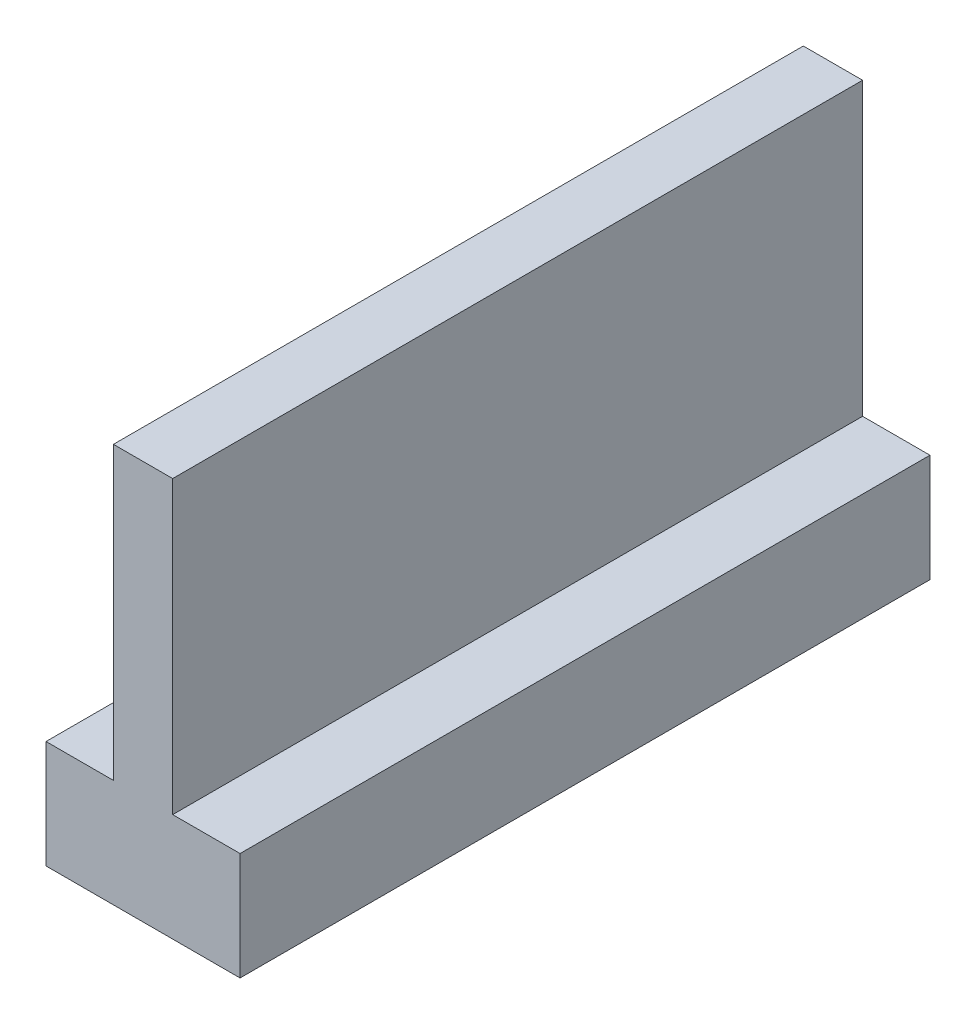
ISO-10303-21;
HEADER;
FILE_DESCRIPTION(('STEP AP214'),'2;1');
FILE_NAME('part.step','',(''),(''),'','','');
FILE_SCHEMA(('AUTOMOTIVE_DESIGN { 1 0 10303 214 1 1 1 1 }'));
ENDSEC;
DATA;
#1=APPLICATION_CONTEXT('core data for automotive mechanical design processes');
#2=APPLICATION_PROTOCOL_DEFINITION('international standard','automotive_design',2000,#1);
#3=PRODUCT_CONTEXT('',#1,'mechanical');
#4=PRODUCT('Part','Part','',(#3));
#5=PRODUCT_RELATED_PRODUCT_CATEGORY('part','',(#4));
#6=PRODUCT_DEFINITION_FORMATION('','',#4);
#7=PRODUCT_DEFINITION_CONTEXT('part definition',#1,'design');
#8=PRODUCT_DEFINITION('design','',#6,#7);
#9=PRODUCT_DEFINITION_SHAPE('','',#8);
#10=(LENGTH_UNIT() NAMED_UNIT(*) SI_UNIT(.MILLI.,.METRE.));
#11=(NAMED_UNIT(*) PLANE_ANGLE_UNIT() SI_UNIT($,.RADIAN.));
#12=(NAMED_UNIT(*) SI_UNIT($,.STERADIAN.) SOLID_ANGLE_UNIT());
#13=UNCERTAINTY_MEASURE_WITH_UNIT(LENGTH_MEASURE(1.E-05),#10,'distance_accuracy_value','');
#14=(GEOMETRIC_REPRESENTATION_CONTEXT(3) GLOBAL_UNCERTAINTY_ASSIGNED_CONTEXT((#13)) GLOBAL_UNIT_ASSIGNED_CONTEXT((#10,
#11,#12)) REPRESENTATION_CONTEXT('',''));
#15=CARTESIAN_POINT('',(0.,0.,0.));
#16=DIRECTION('',(0.,0.,1.));
#17=DIRECTION('',(1.,0.,0.));
#18=AXIS2_PLACEMENT_3D('',#15,#16,#17);
#19=CARTESIAN_POINT('',(18.,0.,64.));
#20=DIRECTION('',(0.,1.,0.));
#21=DIRECTION('',(0.,0.,1.));
#22=AXIS2_PLACEMENT_3D('',#19,#20,#21);
#23=PLANE('',#22);
#24=DIRECTION('',(1.,0.,0.));
#25=VECTOR('',#24,1.);
#26=CARTESIAN_POINT('',(18.,0.,0.));
#27=LINE('',#26,#25);
#28=CARTESIAN_POINT('',(0.,0.,0.));
#29=VERTEX_POINT('',#28);
#30=CARTESIAN_POINT('',(18.,0.,0.));
#31=VERTEX_POINT('',#30);
#32=EDGE_CURVE('E133',#29,#31,#27,.T.);
#33=ORIENTED_EDGE('',*,*,#32,.T.);
#34=DIRECTION('',(0.,0.,-1.));
#35=VECTOR('',#34,1.);
#36=CARTESIAN_POINT('',(18.,0.,64.));
#37=LINE('',#36,#35);
#38=CARTESIAN_POINT('',(18.,0.,64.));
#39=VERTEX_POINT('',#38);
#40=EDGE_CURVE('E11',#39,#31,#37,.T.);
#41=ORIENTED_EDGE('',*,*,#40,.F.);
#42=DIRECTION('',(1.,0.,0.));
#43=VECTOR('',#42,1.);
#44=CARTESIAN_POINT('',(18.,0.,64.));
#45=LINE('',#44,#43);
#46=CARTESIAN_POINT('',(0.,0.,64.));
#47=VERTEX_POINT('',#46);
#48=EDGE_CURVE('E147',#47,#39,#45,.T.);
#49=ORIENTED_EDGE('',*,*,#48,.F.);
#50=DIRECTION('',(0.,0.,-1.));
#51=VECTOR('',#50,1.);
#52=CARTESIAN_POINT('',(0.,0.,64.));
#53=LINE('',#52,#51);
#54=EDGE_CURVE('E129',#47,#29,#53,.T.);
#55=ORIENTED_EDGE('',*,*,#54,.T.);
#56=EDGE_LOOP('',(#33,#41,#49,#55));
#57=FACE_BOUND('',#56,.T.);
#58=ADVANCED_FACE('F37',(#57),#23,.F.);
#59=CARTESIAN_POINT('',(18.,10.,64.));
#60=DIRECTION('',(-1.,0.,0.));
#61=DIRECTION('',(0.,0.,1.));
#62=AXIS2_PLACEMENT_3D('',#59,#60,#61);
#63=PLANE('',#62);
#64=DIRECTION('',(0.,1.,0.));
#65=VECTOR('',#64,1.);
#66=CARTESIAN_POINT('',(18.,10.,0.));
#67=LINE('',#66,#65);
#68=CARTESIAN_POINT('',(18.,10.,0.));
#69=VERTEX_POINT('',#68);
#70=EDGE_CURVE('E136',#31,#69,#67,.T.);
#71=ORIENTED_EDGE('',*,*,#70,.T.);
#72=DIRECTION('',(0.,0.,-1.));
#73=VECTOR('',#72,1.);
#74=CARTESIAN_POINT('',(18.,10.,64.));
#75=LINE('',#74,#73);
#76=CARTESIAN_POINT('',(18.,10.,64.));
#77=VERTEX_POINT('',#76);
#78=EDGE_CURVE('E45',#77,#69,#75,.T.);
#79=ORIENTED_EDGE('',*,*,#78,.F.);
#80=DIRECTION('',(0.,1.,0.));
#81=VECTOR('',#80,1.);
#82=CARTESIAN_POINT('',(18.,10.,64.));
#83=LINE('',#82,#81);
#84=EDGE_CURVE('E96',#39,#77,#83,.T.);
#85=ORIENTED_EDGE('',*,*,#84,.F.);
#86=ORIENTED_EDGE('',*,*,#40,.T.);
#87=EDGE_LOOP('',(#71,#79,#85,#86));
#88=FACE_BOUND('',#87,.T.);
#89=ADVANCED_FACE('F182',(#88),#63,.F.);
#90=CARTESIAN_POINT('',(11.75,10.,64.));
#91=DIRECTION('',(0.,-1.,0.));
#92=DIRECTION('',(0.,0.,-1.));
#93=AXIS2_PLACEMENT_3D('',#90,#91,#92);
#94=PLANE('',#93);
#95=DIRECTION('',(-1.,0.,0.));
#96=VECTOR('',#95,1.);
#97=CARTESIAN_POINT('',(11.75,10.,0.));
#98=LINE('',#97,#96);
#99=CARTESIAN_POINT('',(11.75,10.,0.));
#100=VERTEX_POINT('',#99);
#101=EDGE_CURVE('E138',#69,#100,#98,.T.);
#102=ORIENTED_EDGE('',*,*,#101,.T.);
#103=DIRECTION('',(0.,0.,-1.));
#104=VECTOR('',#103,1.);
#105=CARTESIAN_POINT('',(11.75,10.,64.));
#106=LINE('',#105,#104);
#107=CARTESIAN_POINT('',(11.75,10.,64.));
#108=VERTEX_POINT('',#107);
#109=EDGE_CURVE('E154',#108,#100,#106,.T.);
#110=ORIENTED_EDGE('',*,*,#109,.F.);
#111=DIRECTION('',(-1.,0.,0.));
#112=VECTOR('',#111,1.);
#113=CARTESIAN_POINT('',(11.75,10.,64.));
#114=LINE('',#113,#112);
#115=EDGE_CURVE('E162',#77,#108,#114,.T.);
#116=ORIENTED_EDGE('',*,*,#115,.F.);
#117=ORIENTED_EDGE('',*,*,#78,.T.);
#118=EDGE_LOOP('',(#102,#110,#116,#117));
#119=FACE_BOUND('',#118,.T.);
#120=ADVANCED_FACE('F160',(#119),#94,.F.);
#121=CARTESIAN_POINT('',(11.75,37.,64.));
#122=DIRECTION('',(-1.,0.,0.));
#123=DIRECTION('',(0.,-1.,0.));
#124=AXIS2_PLACEMENT_3D('',#121,#122,#123);
#125=PLANE('',#124);
#126=DIRECTION('',(0.,1.,0.));
#127=VECTOR('',#126,1.);
#128=CARTESIAN_POINT('',(11.75,37.,0.));
#129=LINE('',#128,#127);
#130=CARTESIAN_POINT('',(11.75,37.,0.));
#131=VERTEX_POINT('',#130);
#132=EDGE_CURVE('E140',#100,#131,#129,.T.);
#133=ORIENTED_EDGE('',*,*,#132,.T.);
#134=DIRECTION('',(0.,0.,-1.));
#135=VECTOR('',#134,1.);
#136=CARTESIAN_POINT('',(11.75,37.,64.));
#137=LINE('',#136,#135);
#138=CARTESIAN_POINT('',(11.75,37.,64.));
#139=VERTEX_POINT('',#138);
#140=EDGE_CURVE('E151',#139,#131,#137,.T.);
#141=ORIENTED_EDGE('',*,*,#140,.F.);
#142=DIRECTION('',(0.,1.,0.));
#143=VECTOR('',#142,1.);
#144=CARTESIAN_POINT('',(11.75,37.,64.));
#145=LINE('',#144,#143);
#146=EDGE_CURVE('E174',#108,#139,#145,.T.);
#147=ORIENTED_EDGE('',*,*,#146,.F.);
#148=ORIENTED_EDGE('',*,*,#109,.T.);
#149=EDGE_LOOP('',(#133,#141,#147,#148));
#150=FACE_BOUND('',#149,.T.);
#151=ADVANCED_FACE('F170',(#150),#125,.F.);
#152=CARTESIAN_POINT('',(6.25,37.,64.));
#153=DIRECTION('',(0.,-1.,0.));
#154=DIRECTION('',(0.,0.,-1.));
#155=AXIS2_PLACEMENT_3D('',#152,#153,#154);
#156=PLANE('',#155);
#157=DIRECTION('',(-1.,0.,0.));
#158=VECTOR('',#157,1.);
#159=CARTESIAN_POINT('',(6.25,37.,0.));
#160=LINE('',#159,#158);
#161=CARTESIAN_POINT('',(6.25,37.,0.));
#162=VERTEX_POINT('',#161);
#163=EDGE_CURVE('E142',#131,#162,#160,.T.);
#164=ORIENTED_EDGE('',*,*,#163,.T.);
#165=DIRECTION('',(0.,0.,-1.));
#166=VECTOR('',#165,1.);
#167=CARTESIAN_POINT('',(6.25,37.,64.));
#168=LINE('',#167,#166);
#169=CARTESIAN_POINT('',(6.25,37.,64.));
#170=VERTEX_POINT('',#169);
#171=EDGE_CURVE('E124',#170,#162,#168,.T.);
#172=ORIENTED_EDGE('',*,*,#171,.F.);
#173=DIRECTION('',(-1.,0.,0.));
#174=VECTOR('',#173,1.);
#175=CARTESIAN_POINT('',(6.25,37.,64.));
#176=LINE('',#175,#174);
#177=EDGE_CURVE('E115',#139,#170,#176,.T.);
#178=ORIENTED_EDGE('',*,*,#177,.F.);
#179=ORIENTED_EDGE('',*,*,#140,.T.);
#180=EDGE_LOOP('',(#164,#172,#178,#179));
#181=FACE_BOUND('',#180,.T.);
#182=ADVANCED_FACE('F173',(#181),#156,.F.);
#183=CARTESIAN_POINT('',(6.25,10.,64.));
#184=DIRECTION('',(1.,0.,0.));
#185=DIRECTION('',(0.,1.,0.));
#186=AXIS2_PLACEMENT_3D('',#183,#184,#185);
#187=PLANE('',#186);
#188=DIRECTION('',(0.,-1.,0.));
#189=VECTOR('',#188,1.);
#190=CARTESIAN_POINT('',(6.25,10.,0.));
#191=LINE('',#190,#189);
#192=CARTESIAN_POINT('',(6.25,10.,0.));
#193=VERTEX_POINT('',#192);
#194=EDGE_CURVE('E123',#162,#193,#191,.T.);
#195=ORIENTED_EDGE('',*,*,#194,.T.);
#196=DIRECTION('',(0.,0.,-1.));
#197=VECTOR('',#196,1.);
#198=CARTESIAN_POINT('',(6.25,10.,64.));
#199=LINE('',#198,#197);
#200=CARTESIAN_POINT('',(6.25,10.,64.));
#201=VERTEX_POINT('',#200);
#202=EDGE_CURVE('E120',#201,#193,#199,.T.);
#203=ORIENTED_EDGE('',*,*,#202,.F.);
#204=DIRECTION('',(0.,-1.,0.));
#205=VECTOR('',#204,1.);
#206=CARTESIAN_POINT('',(6.25,10.,64.));
#207=LINE('',#206,#205);
#208=EDGE_CURVE('E109',#170,#201,#207,.T.);
#209=ORIENTED_EDGE('',*,*,#208,.F.);
#210=ORIENTED_EDGE('',*,*,#171,.T.);
#211=EDGE_LOOP('',(#195,#203,#209,#210));
#212=FACE_BOUND('',#211,.T.);
#213=ADVANCED_FACE('F121',(#212),#187,.F.);
#214=CARTESIAN_POINT('',(0.,10.,64.));
#215=DIRECTION('',(0.,-1.,0.));
#216=DIRECTION('',(0.,0.,-1.));
#217=AXIS2_PLACEMENT_3D('',#214,#215,#216);
#218=PLANE('',#217);
#219=DIRECTION('',(-1.,0.,0.));
#220=VECTOR('',#219,1.);
#221=CARTESIAN_POINT('',(0.,10.,0.));
#222=LINE('',#221,#220);
#223=CARTESIAN_POINT('',(0.,10.,0.));
#224=VERTEX_POINT('',#223);
#225=EDGE_CURVE('E82',#193,#224,#222,.T.);
#226=ORIENTED_EDGE('',*,*,#225,.T.);
#227=DIRECTION('',(0.,0.,-1.));
#228=VECTOR('',#227,1.);
#229=CARTESIAN_POINT('',(0.,10.,64.));
#230=LINE('',#229,#228);
#231=CARTESIAN_POINT('',(0.,10.,64.));
#232=VERTEX_POINT('',#231);
#233=EDGE_CURVE('E125',#232,#224,#230,.T.);
#234=ORIENTED_EDGE('',*,*,#233,.F.);
#235=DIRECTION('',(-1.,0.,0.));
#236=VECTOR('',#235,1.);
#237=CARTESIAN_POINT('',(0.,10.,64.));
#238=LINE('',#237,#236);
#239=EDGE_CURVE('E113',#201,#232,#238,.T.);
#240=ORIENTED_EDGE('',*,*,#239,.F.);
#241=ORIENTED_EDGE('',*,*,#202,.T.);
#242=EDGE_LOOP('',(#226,#234,#240,#241));
#243=FACE_BOUND('',#242,.T.);
#244=ADVANCED_FACE('F127',(#243),#218,.F.);
#245=CARTESIAN_POINT('',(0.,0.,64.));
#246=DIRECTION('',(1.,0.,0.));
#247=DIRECTION('',(0.,0.,-1.));
#248=AXIS2_PLACEMENT_3D('',#245,#246,#247);
#249=PLANE('',#248);
#250=DIRECTION('',(0.,-1.,0.));
#251=VECTOR('',#250,1.);
#252=CARTESIAN_POINT('',(0.,0.,0.));
#253=LINE('',#252,#251);
#254=EDGE_CURVE('E88',#224,#29,#253,.T.);
#255=ORIENTED_EDGE('',*,*,#254,.T.);
#256=ORIENTED_EDGE('',*,*,#54,.F.);
#257=DIRECTION('',(0.,-1.,0.));
#258=VECTOR('',#257,1.);
#259=CARTESIAN_POINT('',(0.,0.,64.));
#260=LINE('',#259,#258);
#261=EDGE_CURVE('E53',#232,#47,#260,.T.);
#262=ORIENTED_EDGE('',*,*,#261,.F.);
#263=ORIENTED_EDGE('',*,*,#233,.T.);
#264=EDGE_LOOP('',(#255,#256,#262,#263));
#265=FACE_BOUND('',#264,.T.);
#266=ADVANCED_FACE('F198',(#265),#249,.F.);
#267=CARTESIAN_POINT('',(0.,0.,64.));
#268=DIRECTION('',(0.,0.,-1.));
#269=DIRECTION('',(-1.,0.,0.));
#270=AXIS2_PLACEMENT_3D('',#267,#268,#269);
#271=PLANE('',#270);
#272=ORIENTED_EDGE('',*,*,#48,.T.);
#273=ORIENTED_EDGE('',*,*,#84,.T.);
#274=ORIENTED_EDGE('',*,*,#115,.T.);
#275=ORIENTED_EDGE('',*,*,#146,.T.);
#276=ORIENTED_EDGE('',*,*,#177,.T.);
#277=ORIENTED_EDGE('',*,*,#208,.T.);
#278=ORIENTED_EDGE('',*,*,#239,.T.);
#279=ORIENTED_EDGE('',*,*,#261,.T.);
#280=EDGE_LOOP('',(#272,#273,#274,#275,#276,#277,#278,#279));
#281=FACE_BOUND('',#280,.T.);
#282=ADVANCED_FACE('F111',(#281),#271,.F.);
#283=CARTESIAN_POINT('',(0.,0.,0.));
#284=DIRECTION('',(0.,0.,-1.));
#285=DIRECTION('',(-1.,0.,0.));
#286=AXIS2_PLACEMENT_3D('',#283,#284,#285);
#287=PLANE('',#286);
#288=ORIENTED_EDGE('',*,*,#32,.F.);
#289=ORIENTED_EDGE('',*,*,#254,.F.);
#290=ORIENTED_EDGE('',*,*,#225,.F.);
#291=ORIENTED_EDGE('',*,*,#194,.F.);
#292=ORIENTED_EDGE('',*,*,#163,.F.);
#293=ORIENTED_EDGE('',*,*,#132,.F.);
#294=ORIENTED_EDGE('',*,*,#101,.F.);
#295=ORIENTED_EDGE('',*,*,#70,.F.);
#296=EDGE_LOOP('',(#288,#289,#290,#291,#292,#293,#294,#295));
#297=FACE_BOUND('',#296,.T.);
#298=ADVANCED_FACE('F166',(#297),#287,.T.);
#299=CLOSED_SHELL('',(#58,#89,#120,#151,#182,#213,#244,#266,#282,#298));
#300=MANIFOLD_SOLID_BREP('B2',#299);
#301=ADVANCED_BREP_SHAPE_REPRESENTATION('',(#18,#300),#14);
#302=SHAPE_DEFINITION_REPRESENTATION(#9,#301);
ENDSEC;
END-ISO-10303-21;
